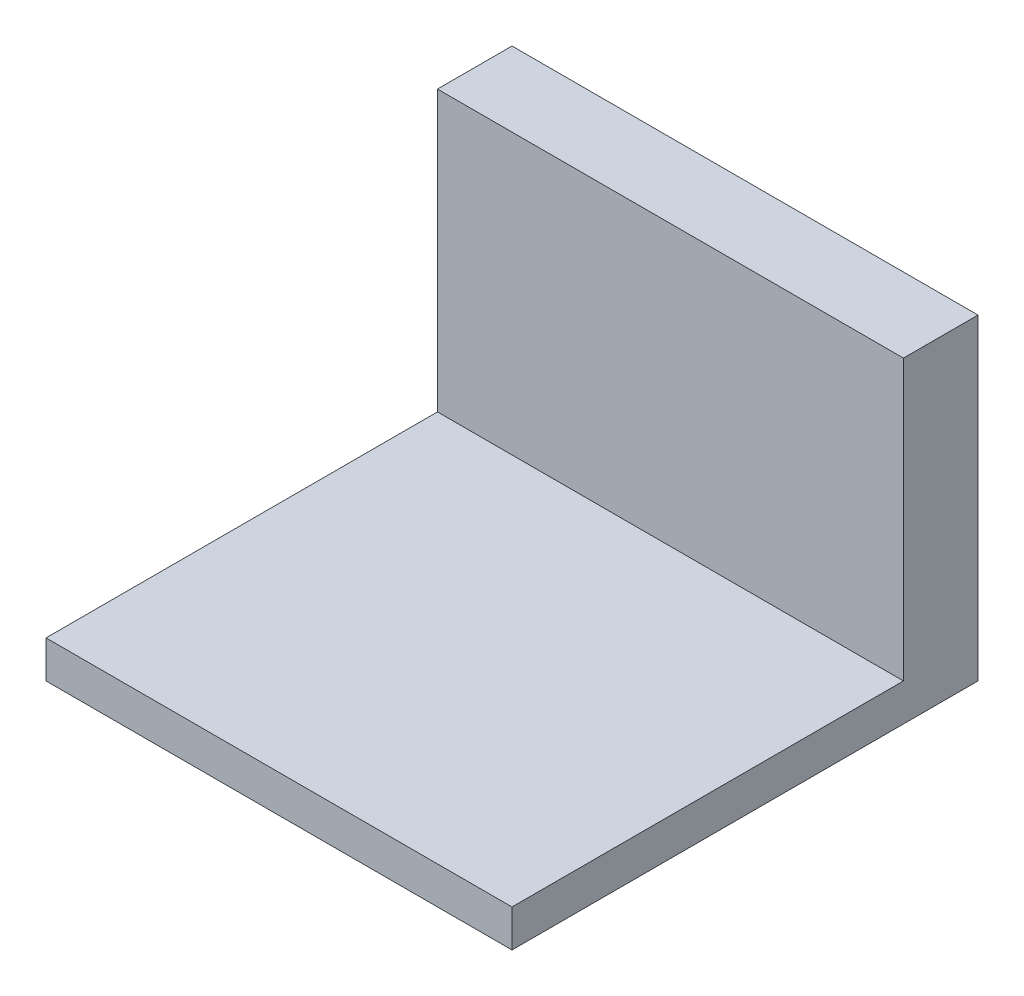
ISO-10303-21;
HEADER;
FILE_DESCRIPTION(('STEP AP214'),'2;1');
FILE_NAME('part.step','',(''),(''),'','','');
FILE_SCHEMA(('AUTOMOTIVE_DESIGN { 1 0 10303 214 1 1 1 1 }'));
ENDSEC;
DATA;
#1=APPLICATION_CONTEXT('core data for automotive mechanical design processes');
#2=APPLICATION_PROTOCOL_DEFINITION('international standard','automotive_design',2000,#1);
#3=PRODUCT_CONTEXT('',#1,'mechanical');
#4=PRODUCT('Part','Part','',(#3));
#5=PRODUCT_RELATED_PRODUCT_CATEGORY('part','',(#4));
#6=PRODUCT_DEFINITION_FORMATION('','',#4);
#7=PRODUCT_DEFINITION_CONTEXT('part definition',#1,'design');
#8=PRODUCT_DEFINITION('design','',#6,#7);
#9=PRODUCT_DEFINITION_SHAPE('','',#8);
#10=(LENGTH_UNIT() NAMED_UNIT(*) SI_UNIT(.MILLI.,.METRE.));
#11=(NAMED_UNIT(*) PLANE_ANGLE_UNIT() SI_UNIT($,.RADIAN.));
#12=(NAMED_UNIT(*) SI_UNIT($,.STERADIAN.) SOLID_ANGLE_UNIT());
#13=UNCERTAINTY_MEASURE_WITH_UNIT(LENGTH_MEASURE(1.E-05),#10,'distance_accuracy_value','');
#14=(GEOMETRIC_REPRESENTATION_CONTEXT(3) GLOBAL_UNCERTAINTY_ASSIGNED_CONTEXT((#13)) GLOBAL_UNIT_ASSIGNED_CONTEXT((#10,
#11,#12)) REPRESENTATION_CONTEXT('',''));
#15=CARTESIAN_POINT('',(0.,0.,0.));
#16=DIRECTION('',(0.,0.,1.));
#17=DIRECTION('',(1.,0.,0.));
#18=AXIS2_PLACEMENT_3D('',#15,#16,#17);
#19=CARTESIAN_POINT('',(-250.,40.,250.));
#20=DIRECTION('',(1.,0.,0.));
#21=DIRECTION('',(0.,0.,-1.));
#22=AXIS2_PLACEMENT_3D('',#19,#20,#21);
#23=PLANE('',#22);
#24=DIRECTION('',(0.,0.,1.));
#25=VECTOR('',#24,1.);
#26=CARTESIAN_POINT('',(-250.,0.,250.));
#27=LINE('',#26,#25);
#28=CARTESIAN_POINT('',(-250.,0.,-250.));
#29=VERTEX_POINT('',#28);
#30=CARTESIAN_POINT('',(-250.,0.,250.));
#31=VERTEX_POINT('',#30);
#32=EDGE_CURVE('E103',#29,#31,#27,.T.);
#33=ORIENTED_EDGE('',*,*,#32,.T.);
#34=DIRECTION('',(0.,-1.,0.));
#35=VECTOR('',#34,1.);
#36=CARTESIAN_POINT('',(-250.,40.,250.));
#37=LINE('',#36,#35);
#38=CARTESIAN_POINT('',(-250.,40.,250.));
#39=VERTEX_POINT('',#38);
#40=EDGE_CURVE('E11',#39,#31,#37,.T.);
#41=ORIENTED_EDGE('',*,*,#40,.F.);
#42=DIRECTION('',(0.,0.,1.));
#43=VECTOR('',#42,1.);
#44=CARTESIAN_POINT('',(-250.,40.,250.));
#45=LINE('',#44,#43);
#46=CARTESIAN_POINT('',(-250.,40.,-170.009351358055));
#47=VERTEX_POINT('',#46);
#48=EDGE_CURVE('E96',#47,#39,#45,.T.);
#49=ORIENTED_EDGE('',*,*,#48,.F.);
#50=DIRECTION('',(0.,-1.,0.));
#51=VECTOR('',#50,1.);
#52=CARTESIAN_POINT('',(-250.,340.,-170.009351358055));
#53=LINE('',#52,#51);
#54=CARTESIAN_POINT('',(-250.,340.,-170.009351358055));
#55=VERTEX_POINT('',#54);
#56=EDGE_CURVE('E113',#55,#47,#53,.T.);
#57=ORIENTED_EDGE('',*,*,#56,.F.);
#58=DIRECTION('',(0.,0.,1.));
#59=VECTOR('',#58,1.);
#60=CARTESIAN_POINT('',(-250.,340.,-250.));
#61=LINE('',#60,#59);
#62=CARTESIAN_POINT('',(-250.,340.,-250.));
#63=VERTEX_POINT('',#62);
#64=EDGE_CURVE('E106',#63,#55,#61,.T.);
#65=ORIENTED_EDGE('',*,*,#64,.F.);
#66=DIRECTION('',(0.,-1.,0.));
#67=VECTOR('',#66,1.);
#68=CARTESIAN_POINT('',(-250.,40.,-250.));
#69=LINE('',#68,#67);
#70=EDGE_CURVE('E88',#63,#29,#69,.T.);
#71=ORIENTED_EDGE('',*,*,#70,.T.);
#72=EDGE_LOOP('',(#33,#41,#49,#57,#65,#71));
#73=FACE_BOUND('',#72,.T.);
#74=ADVANCED_FACE('F43',(#73),#23,.F.);
#75=CARTESIAN_POINT('',(250.,40.,250.));
#76=DIRECTION('',(0.,0.,-1.));
#77=DIRECTION('',(-1.,0.,0.));
#78=AXIS2_PLACEMENT_3D('',#75,#76,#77);
#79=PLANE('',#78);
#80=DIRECTION('',(1.,0.,0.));
#81=VECTOR('',#80,1.);
#82=CARTESIAN_POINT('',(250.,0.,250.));
#83=LINE('',#82,#81);
#84=CARTESIAN_POINT('',(250.,0.,250.));
#85=VERTEX_POINT('',#84);
#86=EDGE_CURVE('E111',#31,#85,#83,.T.);
#87=ORIENTED_EDGE('',*,*,#86,.T.);
#88=DIRECTION('',(0.,-1.,0.));
#89=VECTOR('',#88,1.);
#90=CARTESIAN_POINT('',(250.,40.,250.));
#91=LINE('',#90,#89);
#92=CARTESIAN_POINT('',(250.,40.,250.));
#93=VERTEX_POINT('',#92);
#94=EDGE_CURVE('E51',#93,#85,#91,.T.);
#95=ORIENTED_EDGE('',*,*,#94,.F.);
#96=DIRECTION('',(1.,0.,0.));
#97=VECTOR('',#96,1.);
#98=CARTESIAN_POINT('',(250.,40.,250.));
#99=LINE('',#98,#97);
#100=EDGE_CURVE('E64',#39,#93,#99,.T.);
#101=ORIENTED_EDGE('',*,*,#100,.F.);
#102=ORIENTED_EDGE('',*,*,#40,.T.);
#103=EDGE_LOOP('',(#87,#95,#101,#102));
#104=FACE_BOUND('',#103,.T.);
#105=ADVANCED_FACE('F134',(#104),#79,.F.);
#106=CARTESIAN_POINT('',(250.,40.,250.));
#107=DIRECTION('',(-1.,0.,0.));
#108=DIRECTION('',(0.,0.,1.));
#109=AXIS2_PLACEMENT_3D('',#106,#107,#108);
#110=PLANE('',#109);
#111=DIRECTION('',(0.,0.,-1.));
#112=VECTOR('',#111,1.);
#113=CARTESIAN_POINT('',(250.,0.,250.));
#114=LINE('',#113,#112);
#115=CARTESIAN_POINT('',(250.,0.,-250.));
#116=VERTEX_POINT('',#115);
#117=EDGE_CURVE('E97',#85,#116,#114,.T.);
#118=ORIENTED_EDGE('',*,*,#117,.T.);
#119=DIRECTION('',(0.,-1.,0.));
#120=VECTOR('',#119,1.);
#121=CARTESIAN_POINT('',(250.,40.,-250.));
#122=LINE('',#121,#120);
#123=CARTESIAN_POINT('',(250.,340.,-250.));
#124=VERTEX_POINT('',#123);
#125=EDGE_CURVE('E91',#124,#116,#122,.T.);
#126=ORIENTED_EDGE('',*,*,#125,.F.);
#127=DIRECTION('',(0.,0.,-1.));
#128=VECTOR('',#127,1.);
#129=CARTESIAN_POINT('',(250.,340.,-250.));
#130=LINE('',#129,#128);
#131=CARTESIAN_POINT('',(250.,340.,-170.009351358055));
#132=VERTEX_POINT('',#131);
#133=EDGE_CURVE('E151',#132,#124,#130,.T.);
#134=ORIENTED_EDGE('',*,*,#133,.F.);
#135=DIRECTION('',(0.,-1.,0.));
#136=VECTOR('',#135,1.);
#137=CARTESIAN_POINT('',(250.,340.,-170.009351358055));
#138=LINE('',#137,#136);
#139=CARTESIAN_POINT('',(250.,40.,-170.009351358055));
#140=VERTEX_POINT('',#139);
#141=EDGE_CURVE('E119',#132,#140,#138,.T.);
#142=ORIENTED_EDGE('',*,*,#141,.T.);
#143=DIRECTION('',(0.,0.,-1.));
#144=VECTOR('',#143,1.);
#145=CARTESIAN_POINT('',(250.,40.,250.));
#146=LINE('',#145,#144);
#147=EDGE_CURVE('E108',#93,#140,#146,.T.);
#148=ORIENTED_EDGE('',*,*,#147,.F.);
#149=ORIENTED_EDGE('',*,*,#94,.T.);
#150=EDGE_LOOP('',(#118,#126,#134,#142,#148,#149));
#151=FACE_BOUND('',#150,.T.);
#152=ADVANCED_FACE('F131',(#151),#110,.F.);
#153=CARTESIAN_POINT('',(250.,40.,-250.));
#154=DIRECTION('',(0.,0.,1.));
#155=DIRECTION('',(1.,0.,0.));
#156=AXIS2_PLACEMENT_3D('',#153,#154,#155);
#157=PLANE('',#156);
#158=DIRECTION('',(-1.,0.,0.));
#159=VECTOR('',#158,1.);
#160=CARTESIAN_POINT('',(250.,0.,-250.));
#161=LINE('',#160,#159);
#162=EDGE_CURVE('E84',#116,#29,#161,.T.);
#163=ORIENTED_EDGE('',*,*,#162,.T.);
#164=ORIENTED_EDGE('',*,*,#70,.F.);
#165=DIRECTION('',(-1.,0.,0.));
#166=VECTOR('',#165,1.);
#167=CARTESIAN_POINT('',(-250.,340.,-250.));
#168=LINE('',#167,#166);
#169=EDGE_CURVE('E154',#124,#63,#168,.T.);
#170=ORIENTED_EDGE('',*,*,#169,.F.);
#171=ORIENTED_EDGE('',*,*,#125,.T.);
#172=EDGE_LOOP('',(#163,#164,#170,#171));
#173=FACE_BOUND('',#172,.T.);
#174=ADVANCED_FACE('F86',(#173),#157,.F.);
#175=CARTESIAN_POINT('',(0.,40.,0.));
#176=DIRECTION('',(0.,1.,0.));
#177=DIRECTION('',(0.,0.,1.));
#178=AXIS2_PLACEMENT_3D('',#175,#176,#177);
#179=PLANE('',#178);
#180=DIRECTION('',(1.,0.,0.));
#181=VECTOR('',#180,1.);
#182=CARTESIAN_POINT('',(-250.,40.,-170.009351358055));
#183=LINE('',#182,#181);
#184=EDGE_CURVE('E58',#47,#140,#183,.T.);
#185=ORIENTED_EDGE('',*,*,#184,.F.);
#186=ORIENTED_EDGE('',*,*,#48,.T.);
#187=ORIENTED_EDGE('',*,*,#100,.T.);
#188=ORIENTED_EDGE('',*,*,#147,.T.);
#189=EDGE_LOOP('',(#185,#186,#187,#188));
#190=FACE_BOUND('',#189,.T.);
#191=ADVANCED_FACE('F167',(#190),#179,.T.);
#192=CARTESIAN_POINT('',(0.,0.,0.));
#193=DIRECTION('',(0.,1.,0.));
#194=DIRECTION('',(0.,0.,1.));
#195=AXIS2_PLACEMENT_3D('',#192,#193,#194);
#196=PLANE('',#195);
#197=ORIENTED_EDGE('',*,*,#32,.F.);
#198=ORIENTED_EDGE('',*,*,#162,.F.);
#199=ORIENTED_EDGE('',*,*,#117,.F.);
#200=ORIENTED_EDGE('',*,*,#86,.F.);
#201=EDGE_LOOP('',(#197,#198,#199,#200));
#202=FACE_BOUND('',#201,.T.);
#203=ADVANCED_FACE('F110',(#202),#196,.F.);
#204=CARTESIAN_POINT('',(-250.,340.,-170.009351358055));
#205=DIRECTION('',(0.,0.,-1.));
#206=DIRECTION('',(-1.,0.,0.));
#207=AXIS2_PLACEMENT_3D('',#204,#205,#206);
#208=PLANE('',#207);
#209=ORIENTED_EDGE('',*,*,#184,.T.);
#210=ORIENTED_EDGE('',*,*,#141,.F.);
#211=DIRECTION('',(1.,0.,0.));
#212=VECTOR('',#211,1.);
#213=CARTESIAN_POINT('',(-250.,340.,-170.009351358055));
#214=LINE('',#213,#212);
#215=EDGE_CURVE('E144',#55,#132,#214,.T.);
#216=ORIENTED_EDGE('',*,*,#215,.F.);
#217=ORIENTED_EDGE('',*,*,#56,.T.);
#218=EDGE_LOOP('',(#209,#210,#216,#217));
#219=FACE_BOUND('',#218,.T.);
#220=ADVANCED_FACE('F140',(#219),#208,.F.);
#221=CARTESIAN_POINT('',(0.,340.,0.));
#222=DIRECTION('',(0.,1.,0.));
#223=DIRECTION('',(0.,0.,1.));
#224=AXIS2_PLACEMENT_3D('',#221,#222,#223);
#225=PLANE('',#224);
#226=ORIENTED_EDGE('',*,*,#64,.T.);
#227=ORIENTED_EDGE('',*,*,#215,.T.);
#228=ORIENTED_EDGE('',*,*,#133,.T.);
#229=ORIENTED_EDGE('',*,*,#169,.T.);
#230=EDGE_LOOP('',(#226,#227,#228,#229));
#231=FACE_BOUND('',#230,.T.);
#232=ADVANCED_FACE('F153',(#231),#225,.T.);
#233=CLOSED_SHELL('',(#74,#105,#152,#174,#191,#203,#220,#232));
#234=MANIFOLD_SOLID_BREP('B2',#233);
#235=ADVANCED_BREP_SHAPE_REPRESENTATION('',(#18,#234),#14);
#236=SHAPE_DEFINITION_REPRESENTATION(#9,#235);
ENDSEC;
END-ISO-10303-21;
